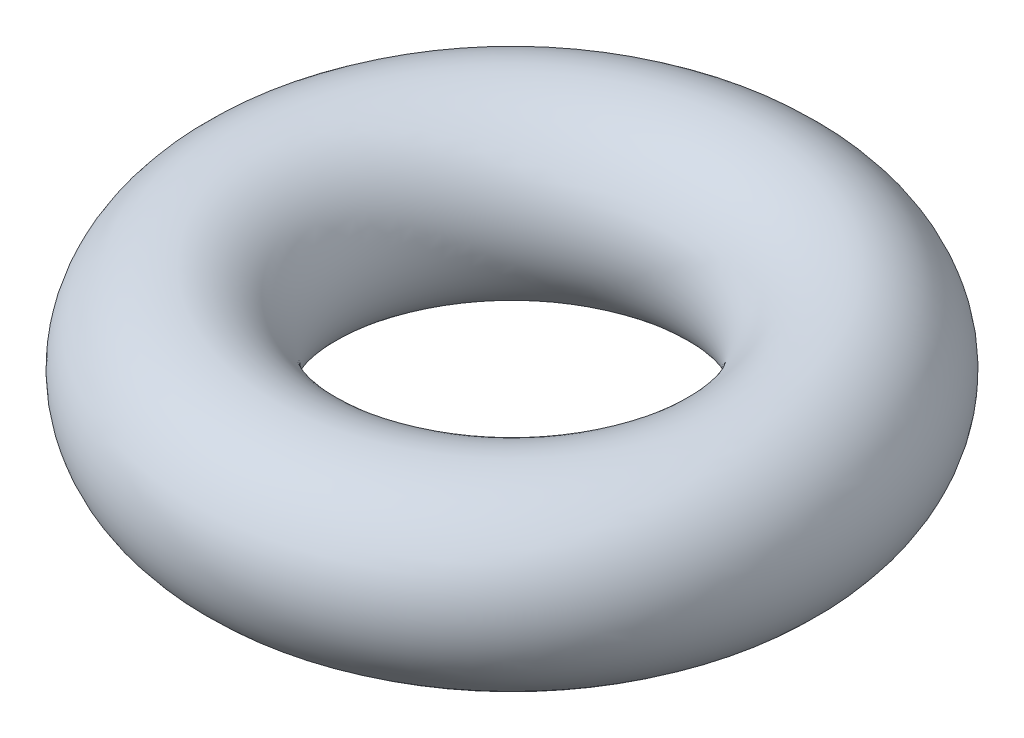
ISO-10303-21;
HEADER;
FILE_DESCRIPTION(('STEP AP214'),'2;1');
FILE_NAME('part.step','',(''),(''),'','','');
FILE_SCHEMA(('AUTOMOTIVE_DESIGN { 1 0 10303 214 1 1 1 1 }'));
ENDSEC;
DATA;
#1=APPLICATION_CONTEXT('core data for automotive mechanical design processes');
#2=APPLICATION_PROTOCOL_DEFINITION('international standard','automotive_design',2000,#1);
#3=PRODUCT_CONTEXT('',#1,'mechanical');
#4=PRODUCT('Part','Part','',(#3));
#5=PRODUCT_RELATED_PRODUCT_CATEGORY('part','',(#4));
#6=PRODUCT_DEFINITION_FORMATION('','',#4);
#7=PRODUCT_DEFINITION_CONTEXT('part definition',#1,'design');
#8=PRODUCT_DEFINITION('design','',#6,#7);
#9=PRODUCT_DEFINITION_SHAPE('','',#8);
#10=(LENGTH_UNIT() NAMED_UNIT(*) SI_UNIT(.MILLI.,.METRE.));
#11=(NAMED_UNIT(*) PLANE_ANGLE_UNIT() SI_UNIT($,.RADIAN.));
#12=(NAMED_UNIT(*) SI_UNIT($,.STERADIAN.) SOLID_ANGLE_UNIT());
#13=UNCERTAINTY_MEASURE_WITH_UNIT(LENGTH_MEASURE(1.E-05),#10,'distance_accuracy_value','');
#14=(GEOMETRIC_REPRESENTATION_CONTEXT(3) GLOBAL_UNCERTAINTY_ASSIGNED_CONTEXT((#13)) GLOBAL_UNIT_ASSIGNED_CONTEXT((#10,
#11,#12)) REPRESENTATION_CONTEXT('',''));
#15=CARTESIAN_POINT('',(0.,0.,0.));
#16=DIRECTION('',(0.,0.,1.));
#17=DIRECTION('',(1.,0.,0.));
#18=AXIS2_PLACEMENT_3D('',#15,#16,#17);
#19=CARTESIAN_POINT('',(0.,0.,0.));
#20=DIRECTION('',(0.,1.,0.));
#21=DIRECTION('',(0.,0.,1.));
#22=AXIS2_PLACEMENT_3D('',#19,#20,#21);
#23=TOROIDAL_SURFACE('',#22,50.8,19.05);
#24=CARTESIAN_POINT('',(0.,0.,69.85));
#25=VERTEX_POINT('',#24);
#26=VERTEX_LOOP('',#25);
#27=FACE_BOUND('',#26,.T.);
#28=ADVANCED_FACE('F28',(#27),#23,.T.);
#29=CLOSED_SHELL('',(#28));
#30=MANIFOLD_SOLID_BREP('B2',#29);
#31=ADVANCED_BREP_SHAPE_REPRESENTATION('',(#18,#30),#14);
#32=SHAPE_DEFINITION_REPRESENTATION(#9,#31);
ENDSEC;
END-ISO-10303-21;
